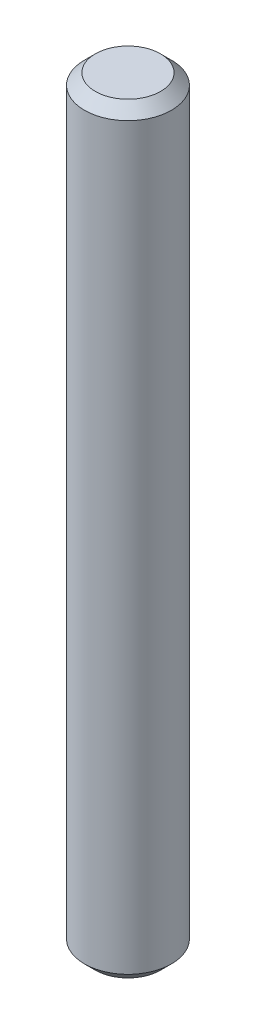
ISO-10303-21;
HEADER;
FILE_DESCRIPTION(('STEP AP214'),'2;1');
FILE_NAME('part.step','',(''),(''),'','','');
FILE_SCHEMA(('AUTOMOTIVE_DESIGN { 1 0 10303 214 1 1 1 1 }'));
ENDSEC;
DATA;
#1=APPLICATION_CONTEXT('core data for automotive mechanical design processes');
#2=APPLICATION_PROTOCOL_DEFINITION('international standard','automotive_design',2000,#1);
#3=PRODUCT_CONTEXT('',#1,'mechanical');
#4=PRODUCT('Part','Part','',(#3));
#5=PRODUCT_RELATED_PRODUCT_CATEGORY('part','',(#4));
#6=PRODUCT_DEFINITION_FORMATION('','',#4);
#7=PRODUCT_DEFINITION_CONTEXT('part definition',#1,'design');
#8=PRODUCT_DEFINITION('design','',#6,#7);
#9=PRODUCT_DEFINITION_SHAPE('','',#8);
#10=(LENGTH_UNIT() NAMED_UNIT(*) SI_UNIT(.MILLI.,.METRE.));
#11=(NAMED_UNIT(*) PLANE_ANGLE_UNIT() SI_UNIT($,.RADIAN.));
#12=(NAMED_UNIT(*) SI_UNIT($,.STERADIAN.) SOLID_ANGLE_UNIT());
#13=UNCERTAINTY_MEASURE_WITH_UNIT(LENGTH_MEASURE(1.E-05),#10,'distance_accuracy_value','');
#14=(GEOMETRIC_REPRESENTATION_CONTEXT(3) GLOBAL_UNCERTAINTY_ASSIGNED_CONTEXT((#13)) GLOBAL_UNIT_ASSIGNED_CONTEXT((#10,
#11,#12)) REPRESENTATION_CONTEXT('',''));
#15=CARTESIAN_POINT('',(0.,0.,0.));
#16=DIRECTION('',(0.,0.,1.));
#17=DIRECTION('',(1.,0.,0.));
#18=AXIS2_PLACEMENT_3D('',#15,#16,#17);
#19=CARTESIAN_POINT('',(0.,70.,0.));
#20=DIRECTION('',(0.,-1.,0.));
#21=DIRECTION('',(0.,0.,-1.));
#22=AXIS2_PLACEMENT_3D('',#19,#20,#21);
#23=CYLINDRICAL_SURFACE('',#22,4.);
#24=CARTESIAN_POINT('',(0.,0.999999999999987,0.));
#25=DIRECTION('',(0.,1.,0.));
#26=DIRECTION('',(0.,0.,1.));
#27=AXIS2_PLACEMENT_3D('',#24,#25,#26);
#28=CIRCLE('',#27,4.);
#29=CARTESIAN_POINT('',(0.,0.999999999999987,4.));
#30=VERTEX_POINT('',#29);
#31=EDGE_CURVE('E44',#30,#30,#28,.T.);
#32=ORIENTED_EDGE('',*,*,#31,.T.);
#33=EDGE_LOOP('',(#32));
#34=FACE_BOUND('',#33,.T.);
#35=CARTESIAN_POINT('',(0.,69.,0.));
#36=DIRECTION('',(0.,1.,0.));
#37=DIRECTION('',(0.,0.,1.));
#38=AXIS2_PLACEMENT_3D('',#35,#36,#37);
#39=CIRCLE('',#38,4.);
#40=CARTESIAN_POINT('',(0.,69.,4.));
#41=VERTEX_POINT('',#40);
#42=EDGE_CURVE('E48',#41,#41,#39,.F.);
#43=ORIENTED_EDGE('',*,*,#42,.T.);
#44=EDGE_LOOP('',(#43));
#45=FACE_BOUND('',#44,.T.);
#46=ADVANCED_FACE('F33',(#34,#45),#23,.T.);
#47=CARTESIAN_POINT('',(0.,70.,0.));
#48=DIRECTION('',(0.,1.,0.));
#49=DIRECTION('',(0.,0.,1.));
#50=AXIS2_PLACEMENT_3D('',#47,#48,#49);
#51=PLANE('',#50);
#52=CARTESIAN_POINT('',(0.,70.,0.));
#53=DIRECTION('',(0.,1.,0.));
#54=DIRECTION('',(0.,0.,1.));
#55=AXIS2_PLACEMENT_3D('',#52,#53,#54);
#56=CIRCLE('',#55,3.);
#57=CARTESIAN_POINT('',(0.,70.,3.));
#58=VERTEX_POINT('',#57);
#59=EDGE_CURVE('E10',#58,#58,#56,.T.);
#60=ORIENTED_EDGE('',*,*,#59,.T.);
#61=EDGE_LOOP('',(#60));
#62=FACE_BOUND('',#61,.T.);
#63=ADVANCED_FACE('F64',(#62),#51,.T.);
#64=CARTESIAN_POINT('',(0.,0.,0.));
#65=DIRECTION('',(0.,1.,0.));
#66=DIRECTION('',(0.,0.,1.));
#67=AXIS2_PLACEMENT_3D('',#64,#65,#66);
#68=PLANE('',#67);
#69=CARTESIAN_POINT('',(0.,0.,0.));
#70=DIRECTION('',(0.,1.,0.));
#71=DIRECTION('',(0.,0.,1.));
#72=AXIS2_PLACEMENT_3D('',#69,#70,#71);
#73=CIRCLE('',#72,3.00000000000001);
#74=CARTESIAN_POINT('',(0.,0.,3.00000000000001));
#75=VERTEX_POINT('',#74);
#76=EDGE_CURVE('E40',#75,#75,#73,.F.);
#77=ORIENTED_EDGE('',*,*,#76,.T.);
#78=EDGE_LOOP('',(#77));
#79=FACE_BOUND('',#78,.T.);
#80=ADVANCED_FACE('F61',(#79),#68,.F.);
#81=CARTESIAN_POINT('',(0.,0.999999999999987,0.));
#82=DIRECTION('',(0.,1.,0.));
#83=DIRECTION('',(0.,0.,1.));
#84=AXIS2_PLACEMENT_3D('',#81,#82,#83);
#85=CONICAL_SURFACE('',#84,4.,0.78539816339745);
#86=ORIENTED_EDGE('',*,*,#76,.F.);
#87=EDGE_LOOP('',(#86));
#88=FACE_BOUND('',#87,.T.);
#89=ORIENTED_EDGE('',*,*,#31,.F.);
#90=EDGE_LOOP('',(#89));
#91=FACE_BOUND('',#90,.T.);
#92=ADVANCED_FACE('F57',(#88,#91),#85,.T.);
#93=CARTESIAN_POINT('',(0.,70.,0.));
#94=DIRECTION('',(0.,-1.,0.));
#95=DIRECTION('',(0.,0.,-1.));
#96=AXIS2_PLACEMENT_3D('',#93,#94,#95);
#97=CONICAL_SURFACE('',#96,3.,0.785398163397443);
#98=ORIENTED_EDGE('',*,*,#42,.F.);
#99=EDGE_LOOP('',(#98));
#100=FACE_BOUND('',#99,.T.);
#101=ORIENTED_EDGE('',*,*,#59,.F.);
#102=EDGE_LOOP('',(#101));
#103=FACE_BOUND('',#102,.T.);
#104=ADVANCED_FACE('F35',(#100,#103),#97,.T.);
#105=CLOSED_SHELL('',(#46,#63,#80,#92,#104));
#106=MANIFOLD_SOLID_BREP('B2',#105);
#107=ADVANCED_BREP_SHAPE_REPRESENTATION('',(#18,#106),#14);
#108=SHAPE_DEFINITION_REPRESENTATION(#9,#107);
ENDSEC;
END-ISO-10303-21;
